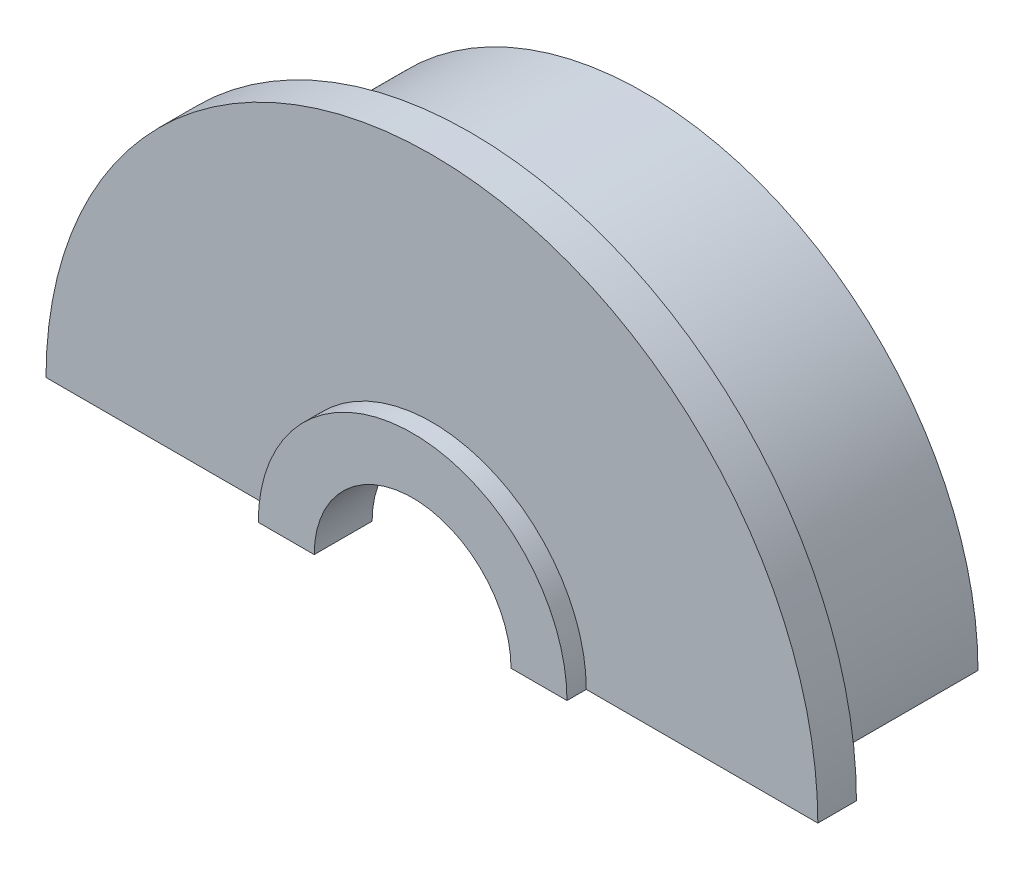
ISO-10303-21;
HEADER;
FILE_DESCRIPTION(('STEP AP214'),'2;1');
FILE_NAME('part.step','',(''),(''),'','','');
FILE_SCHEMA(('AUTOMOTIVE_DESIGN { 1 0 10303 214 1 1 1 1 }'));
ENDSEC;
DATA;
#1=APPLICATION_CONTEXT('core data for automotive mechanical design processes');
#2=APPLICATION_PROTOCOL_DEFINITION('international standard','automotive_design',2000,#1);
#3=PRODUCT_CONTEXT('',#1,'mechanical');
#4=PRODUCT('Part','Part','',(#3));
#5=PRODUCT_RELATED_PRODUCT_CATEGORY('part','',(#4));
#6=PRODUCT_DEFINITION_FORMATION('','',#4);
#7=PRODUCT_DEFINITION_CONTEXT('part definition',#1,'design');
#8=PRODUCT_DEFINITION('design','',#6,#7);
#9=PRODUCT_DEFINITION_SHAPE('','',#8);
#10=(LENGTH_UNIT() NAMED_UNIT(*) SI_UNIT(.MILLI.,.METRE.));
#11=(NAMED_UNIT(*) PLANE_ANGLE_UNIT() SI_UNIT($,.RADIAN.));
#12=(NAMED_UNIT(*) SI_UNIT($,.STERADIAN.) SOLID_ANGLE_UNIT());
#13=UNCERTAINTY_MEASURE_WITH_UNIT(LENGTH_MEASURE(1.E-05),#10,'distance_accuracy_value','');
#14=(GEOMETRIC_REPRESENTATION_CONTEXT(3) GLOBAL_UNCERTAINTY_ASSIGNED_CONTEXT((#13)) GLOBAL_UNIT_ASSIGNED_CONTEXT((#10,
#11,#12)) REPRESENTATION_CONTEXT('',''));
#15=CARTESIAN_POINT('',(0.,0.,0.));
#16=DIRECTION('',(0.,0.,1.));
#17=DIRECTION('',(1.,0.,0.));
#18=AXIS2_PLACEMENT_3D('',#15,#16,#17);
#19=CARTESIAN_POINT('',(0.,0.,9.));
#20=DIRECTION('',(0.,0.,-1.));
#21=DIRECTION('',(-1.,0.,0.));
#22=AXIS2_PLACEMENT_3D('',#19,#20,#21);
#23=CYLINDRICAL_SURFACE('',#22,8.125);
#24=CARTESIAN_POINT('',(0.,0.,3.));
#25=DIRECTION('',(0.,0.,-1.));
#26=DIRECTION('',(-1.,0.,0.));
#27=AXIS2_PLACEMENT_3D('',#24,#25,#26);
#28=CIRCLE('',#27,8.125);
#29=CARTESIAN_POINT('',(8.125,0.,3.));
#30=VERTEX_POINT('',#29);
#31=CARTESIAN_POINT('',(-8.125,0.,3.));
#32=VERTEX_POINT('',#31);
#33=EDGE_CURVE('E196',#30,#32,#28,.F.);
#34=ORIENTED_EDGE('',*,*,#33,.F.);
#35=DIRECTION('',(0.,0.,-1.));
#36=VECTOR('',#35,1.);
#37=CARTESIAN_POINT('',(8.125,0.,9.));
#38=LINE('',#37,#36);
#39=CARTESIAN_POINT('',(8.125,0.,9.));
#40=VERTEX_POINT('',#39);
#41=EDGE_CURVE('E154',#30,#40,#38,.F.);
#42=ORIENTED_EDGE('',*,*,#41,.T.);
#43=CARTESIAN_POINT('',(0.,0.,9.));
#44=DIRECTION('',(0.,0.,-1.));
#45=DIRECTION('',(-1.,0.,0.));
#46=AXIS2_PLACEMENT_3D('',#43,#44,#45);
#47=CIRCLE('',#46,8.125);
#48=CARTESIAN_POINT('',(-8.125,0.,9.));
#49=VERTEX_POINT('',#48);
#50=EDGE_CURVE('E181',#49,#40,#47,.T.);
#51=ORIENTED_EDGE('',*,*,#50,.F.);
#52=DIRECTION('',(0.,0.,-1.));
#53=VECTOR('',#52,1.);
#54=CARTESIAN_POINT('',(-8.125,0.,9.));
#55=LINE('',#54,#53);
#56=EDGE_CURVE('E146',#49,#32,#55,.T.);
#57=ORIENTED_EDGE('',*,*,#56,.T.);
#58=EDGE_LOOP('',(#34,#42,#51,#57));
#59=FACE_BOUND('',#58,.T.);
#60=ADVANCED_FACE('F37',(#59),#23,.F.);
#61=CARTESIAN_POINT('',(0.,0.,9.));
#62=DIRECTION('',(0.,0.,-1.));
#63=DIRECTION('',(-1.,0.,0.));
#64=AXIS2_PLACEMENT_3D('',#61,#62,#63);
#65=CYLINDRICAL_SURFACE('',#64,17.3);
#66=CARTESIAN_POINT('',(0.,0.,9.));
#67=DIRECTION('',(0.,0.,1.));
#68=DIRECTION('',(1.,0.,0.));
#69=AXIS2_PLACEMENT_3D('',#66,#67,#68);
#70=CIRCLE('',#69,17.3);
#71=CARTESIAN_POINT('',(17.3,0.,9.));
#72=VERTEX_POINT('',#71);
#73=CARTESIAN_POINT('',(-17.3,0.,9.));
#74=VERTEX_POINT('',#73);
#75=EDGE_CURVE('E187',#72,#74,#70,.T.);
#76=ORIENTED_EDGE('',*,*,#75,.F.);
#77=DIRECTION('',(0.,0.,-1.));
#78=VECTOR('',#77,1.);
#79=CARTESIAN_POINT('',(17.3,0.,9.));
#80=LINE('',#79,#78);
#81=CARTESIAN_POINT('',(17.3,0.,0.));
#82=VERTEX_POINT('',#81);
#83=EDGE_CURVE('E153',#72,#82,#80,.T.);
#84=ORIENTED_EDGE('',*,*,#83,.T.);
#85=CARTESIAN_POINT('',(0.,0.,0.));
#86=DIRECTION('',(0.,0.,1.));
#87=DIRECTION('',(1.,0.,0.));
#88=AXIS2_PLACEMENT_3D('',#85,#86,#87);
#89=CIRCLE('',#88,17.3);
#90=CARTESIAN_POINT('',(-17.3,0.,0.));
#91=VERTEX_POINT('',#90);
#92=EDGE_CURVE('E186',#82,#91,#89,.T.);
#93=ORIENTED_EDGE('',*,*,#92,.T.);
#94=DIRECTION('',(0.,0.,-1.));
#95=VECTOR('',#94,1.);
#96=CARTESIAN_POINT('',(-17.3,0.,9.));
#97=LINE('',#96,#95);
#98=EDGE_CURVE('E144',#91,#74,#97,.F.);
#99=ORIENTED_EDGE('',*,*,#98,.T.);
#100=EDGE_LOOP('',(#76,#84,#93,#99));
#101=FACE_BOUND('',#100,.T.);
#102=ADVANCED_FACE('F39',(#101),#65,.T.);
#103=CARTESIAN_POINT('',(0.,0.,0.));
#104=DIRECTION('',(0.,0.,1.));
#105=DIRECTION('',(1.,0.,0.));
#106=AXIS2_PLACEMENT_3D('',#103,#104,#105);
#107=PLANE('',#106);
#108=DIRECTION('',(-1.,0.,0.));
#109=VECTOR('',#108,1.);
#110=CARTESIAN_POINT('',(0.,0.,0.));
#111=LINE('',#110,#109);
#112=CARTESIAN_POINT('',(10.75,0.,0.));
#113=VERTEX_POINT('',#112);
#114=EDGE_CURVE('E140',#82,#113,#111,.T.);
#115=ORIENTED_EDGE('',*,*,#114,.T.);
#116=CARTESIAN_POINT('',(0.,0.,0.));
#117=DIRECTION('',(0.,0.,-1.));
#118=DIRECTION('',(-1.,0.,0.));
#119=AXIS2_PLACEMENT_3D('',#116,#117,#118);
#120=CIRCLE('',#119,10.75);
#121=CARTESIAN_POINT('',(-10.75,0.,0.));
#122=VERTEX_POINT('',#121);
#123=EDGE_CURVE('E128',#122,#113,#120,.T.);
#124=ORIENTED_EDGE('',*,*,#123,.F.);
#125=EDGE_CURVE('E138',#122,#91,#111,.T.);
#126=ORIENTED_EDGE('',*,*,#125,.T.);
#127=ORIENTED_EDGE('',*,*,#92,.F.);
#128=EDGE_LOOP('',(#115,#124,#126,#127));
#129=FACE_BOUND('',#128,.T.);
#130=ADVANCED_FACE('F136',(#129),#107,.F.);
#131=CARTESIAN_POINT('',(0.,0.,9.));
#132=DIRECTION('',(0.,0.,1.));
#133=DIRECTION('',(1.,0.,0.));
#134=AXIS2_PLACEMENT_3D('',#131,#132,#133);
#135=PLANE('',#134);
#136=ORIENTED_EDGE('',*,*,#50,.T.);
#137=DIRECTION('',(-1.,0.,0.));
#138=VECTOR('',#137,1.);
#139=CARTESIAN_POINT('',(0.,0.,9.));
#140=LINE('',#139,#138);
#141=CARTESIAN_POINT('',(5.1,0.,9.));
#142=VERTEX_POINT('',#141);
#143=EDGE_CURVE('E158',#40,#142,#140,.T.);
#144=ORIENTED_EDGE('',*,*,#143,.T.);
#145=CARTESIAN_POINT('',(0.,0.,9.));
#146=DIRECTION('',(0.,0.,1.));
#147=DIRECTION('',(1.,0.,0.));
#148=AXIS2_PLACEMENT_3D('',#145,#146,#147);
#149=CIRCLE('',#148,5.1);
#150=CARTESIAN_POINT('',(-5.1,0.,9.));
#151=VERTEX_POINT('',#150);
#152=EDGE_CURVE('E174',#142,#151,#149,.T.);
#153=ORIENTED_EDGE('',*,*,#152,.T.);
#154=EDGE_CURVE('E151',#151,#49,#140,.T.);
#155=ORIENTED_EDGE('',*,*,#154,.T.);
#156=EDGE_LOOP('',(#136,#144,#153,#155));
#157=FACE_BOUND('',#156,.T.);
#158=ADVANCED_FACE('F204',(#157),#135,.F.);
#159=CARTESIAN_POINT('',(0.,0.,11.));
#160=DIRECTION('',(0.,0.,1.));
#161=DIRECTION('',(1.,0.,0.));
#162=AXIS2_PLACEMENT_3D('',#159,#160,#161);
#163=PLANE('',#162);
#164=CARTESIAN_POINT('',(0.,0.,11.));
#165=DIRECTION('',(0.,0.,1.));
#166=DIRECTION('',(-1.,0.,0.));
#167=AXIS2_PLACEMENT_3D('',#164,#165,#166);
#168=CIRCLE('',#167,8.);
#169=CARTESIAN_POINT('',(8.,0.,11.));
#170=VERTEX_POINT('',#169);
#171=CARTESIAN_POINT('',(-8.,0.,11.));
#172=VERTEX_POINT('',#171);
#173=EDGE_CURVE('E60',#170,#172,#168,.T.);
#174=ORIENTED_EDGE('',*,*,#173,.F.);
#175=DIRECTION('',(1.,0.,0.));
#176=VECTOR('',#175,1.);
#177=CARTESIAN_POINT('',(25.5515040485711,0.,11.));
#178=LINE('',#177,#176);
#179=CARTESIAN_POINT('',(20.,0.,11.));
#180=VERTEX_POINT('',#179);
#181=EDGE_CURVE('E207',#170,#180,#178,.T.);
#182=ORIENTED_EDGE('',*,*,#181,.T.);
#183=CARTESIAN_POINT('',(0.,0.,11.));
#184=DIRECTION('',(0.,0.,1.));
#185=DIRECTION('',(1.,0.,0.));
#186=AXIS2_PLACEMENT_3D('',#183,#184,#185);
#187=CIRCLE('',#186,20.);
#188=CARTESIAN_POINT('',(-20.,0.,11.));
#189=VERTEX_POINT('',#188);
#190=EDGE_CURVE('E178',#180,#189,#187,.T.);
#191=ORIENTED_EDGE('',*,*,#190,.T.);
#192=EDGE_CURVE('E206',#189,#172,#178,.T.);
#193=ORIENTED_EDGE('',*,*,#192,.T.);
#194=EDGE_LOOP('',(#174,#182,#191,#193));
#195=FACE_BOUND('',#194,.T.);
#196=ADVANCED_FACE('F242',(#195),#163,.T.);
#197=CARTESIAN_POINT('',(0.,0.,9.));
#198=DIRECTION('',(0.,0.,1.));
#199=DIRECTION('',(1.,0.,0.));
#200=AXIS2_PLACEMENT_3D('',#197,#198,#199);
#201=CIRCLE('',#200,20.);
#202=CARTESIAN_POINT('',(20.,0.,9.));
#203=VERTEX_POINT('',#202);
#204=CARTESIAN_POINT('',(-20.,0.,9.));
#205=VERTEX_POINT('',#204);
#206=EDGE_CURVE('E177',#203,#205,#201,.T.);
#207=ORIENTED_EDGE('',*,*,#206,.F.);
#208=DIRECTION('',(-1.,0.,0.));
#209=VECTOR('',#208,1.);
#210=CARTESIAN_POINT('',(0.,0.,9.));
#211=LINE('',#210,#209);
#212=EDGE_CURVE('E156',#203,#72,#211,.T.);
#213=ORIENTED_EDGE('',*,*,#212,.T.);
#214=ORIENTED_EDGE('',*,*,#75,.T.);
#215=EDGE_CURVE('E148',#74,#205,#211,.T.);
#216=ORIENTED_EDGE('',*,*,#215,.T.);
#217=EDGE_LOOP('',(#207,#213,#214,#216));
#218=FACE_BOUND('',#217,.T.);
#219=ADVANCED_FACE('F250',(#218),#135,.F.);
#220=CARTESIAN_POINT('',(0.,0.,11.));
#221=DIRECTION('',(0.,0.,-1.));
#222=DIRECTION('',(-1.,0.,0.));
#223=AXIS2_PLACEMENT_3D('',#220,#221,#222);
#224=CYLINDRICAL_SURFACE('',#223,20.);
#225=ORIENTED_EDGE('',*,*,#190,.F.);
#226=DIRECTION('',(0.,0.,-1.));
#227=VECTOR('',#226,1.);
#228=CARTESIAN_POINT('',(20.,0.,11.));
#229=LINE('',#228,#227);
#230=EDGE_CURVE('E171',#180,#203,#229,.T.);
#231=ORIENTED_EDGE('',*,*,#230,.T.);
#232=ORIENTED_EDGE('',*,*,#206,.T.);
#233=DIRECTION('',(0.,0.,-1.));
#234=VECTOR('',#233,1.);
#235=CARTESIAN_POINT('',(-20.,0.,11.));
#236=LINE('',#235,#234);
#237=EDGE_CURVE('E166',#205,#189,#236,.F.);
#238=ORIENTED_EDGE('',*,*,#237,.T.);
#239=EDGE_LOOP('',(#225,#231,#232,#238));
#240=FACE_BOUND('',#239,.T.);
#241=ADVANCED_FACE('F244',(#240),#224,.T.);
#242=CARTESIAN_POINT('',(0.,0.,11.));
#243=DIRECTION('',(0.,0.,-1.));
#244=DIRECTION('',(-1.,0.,0.));
#245=AXIS2_PLACEMENT_3D('',#242,#243,#244);
#246=CYLINDRICAL_SURFACE('',#245,5.1);
#247=DIRECTION('',(0.,0.,-1.));
#248=VECTOR('',#247,1.);
#249=CARTESIAN_POINT('',(5.1,0.,11.));
#250=LINE('',#249,#248);
#251=CARTESIAN_POINT('',(5.1,0.,12.));
#252=VERTEX_POINT('',#251);
#253=EDGE_CURVE('E193',#252,#142,#250,.T.);
#254=ORIENTED_EDGE('',*,*,#253,.F.);
#255=CARTESIAN_POINT('',(0.,0.,12.));
#256=DIRECTION('',(0.,0.,-1.));
#257=DIRECTION('',(1.,0.,0.));
#258=AXIS2_PLACEMENT_3D('',#255,#256,#257);
#259=CIRCLE('',#258,5.1);
#260=CARTESIAN_POINT('',(-5.1,0.,12.));
#261=VERTEX_POINT('',#260);
#262=EDGE_CURVE('E220',#261,#252,#259,.T.);
#263=ORIENTED_EDGE('',*,*,#262,.F.);
#264=DIRECTION('',(0.,0.,-1.));
#265=VECTOR('',#264,1.);
#266=CARTESIAN_POINT('',(-5.1,0.,11.));
#267=LINE('',#266,#265);
#268=EDGE_CURVE('E190',#151,#261,#267,.F.);
#269=ORIENTED_EDGE('',*,*,#268,.F.);
#270=ORIENTED_EDGE('',*,*,#152,.F.);
#271=EDGE_LOOP('',(#254,#263,#269,#270));
#272=FACE_BOUND('',#271,.T.);
#273=ADVANCED_FACE('F239',(#272),#246,.F.);
#274=CARTESIAN_POINT('',(25.5515040485711,0.,11.));
#275=DIRECTION('',(0.,1.,0.));
#276=DIRECTION('',(0.,0.,1.));
#277=AXIS2_PLACEMENT_3D('',#274,#275,#276);
#278=PLANE('',#277);
#279=ORIENTED_EDGE('',*,*,#125,.F.);
#280=DIRECTION('',(0.,0.,-1.));
#281=VECTOR('',#280,1.);
#282=CARTESIAN_POINT('',(-10.75,0.,3.));
#283=LINE('',#282,#281);
#284=CARTESIAN_POINT('',(-10.75,0.,3.));
#285=VERTEX_POINT('',#284);
#286=EDGE_CURVE('E125',#122,#285,#283,.F.);
#287=ORIENTED_EDGE('',*,*,#286,.T.);
#288=DIRECTION('',(-1.,0.,0.));
#289=VECTOR('',#288,1.);
#290=CARTESIAN_POINT('',(25.5515040485711,0.,3.));
#291=LINE('',#290,#289);
#292=EDGE_CURVE('E132',#32,#285,#291,.T.);
#293=ORIENTED_EDGE('',*,*,#292,.F.);
#294=ORIENTED_EDGE('',*,*,#56,.F.);
#295=ORIENTED_EDGE('',*,*,#154,.F.);
#296=ORIENTED_EDGE('',*,*,#268,.T.);
#297=DIRECTION('',(1.,0.,0.));
#298=VECTOR('',#297,1.);
#299=CARTESIAN_POINT('',(-5.1,0.,12.));
#300=LINE('',#299,#298);
#301=CARTESIAN_POINT('',(-8.,0.,12.));
#302=VERTEX_POINT('',#301);
#303=EDGE_CURVE('E223',#302,#261,#300,.T.);
#304=ORIENTED_EDGE('',*,*,#303,.F.);
#305=DIRECTION('',(0.,0.,-1.));
#306=VECTOR('',#305,1.);
#307=CARTESIAN_POINT('',(-8.,0.,12.));
#308=LINE('',#307,#306);
#309=EDGE_CURVE('E210',#302,#172,#308,.T.);
#310=ORIENTED_EDGE('',*,*,#309,.T.);
#311=ORIENTED_EDGE('',*,*,#192,.F.);
#312=ORIENTED_EDGE('',*,*,#237,.F.);
#313=ORIENTED_EDGE('',*,*,#215,.F.);
#314=ORIENTED_EDGE('',*,*,#98,.F.);
#315=EDGE_LOOP('',(#279,#287,#293,#294,#295,#296,#304,#310,#311,#312,#313,#314));
#316=FACE_BOUND('',#315,.T.);
#317=ADVANCED_FACE('F142',(#316),#278,.F.);
#318=DIRECTION('',(-1.,0.,0.));
#319=VECTOR('',#318,1.);
#320=CARTESIAN_POINT('',(25.5515040485711,0.,3.));
#321=LINE('',#320,#319);
#322=CARTESIAN_POINT('',(10.75,0.,3.));
#323=VERTEX_POINT('',#322);
#324=EDGE_CURVE('E45',#323,#30,#321,.T.);
#325=ORIENTED_EDGE('',*,*,#324,.F.);
#326=DIRECTION('',(0.,0.,-1.));
#327=VECTOR('',#326,1.);
#328=CARTESIAN_POINT('',(10.75,0.,3.));
#329=LINE('',#328,#327);
#330=EDGE_CURVE('E11',#323,#113,#329,.T.);
#331=ORIENTED_EDGE('',*,*,#330,.T.);
#332=ORIENTED_EDGE('',*,*,#114,.F.);
#333=ORIENTED_EDGE('',*,*,#83,.F.);
#334=ORIENTED_EDGE('',*,*,#212,.F.);
#335=ORIENTED_EDGE('',*,*,#230,.F.);
#336=ORIENTED_EDGE('',*,*,#181,.F.);
#337=DIRECTION('',(0.,0.,-1.));
#338=VECTOR('',#337,1.);
#339=CARTESIAN_POINT('',(8.,0.,12.));
#340=LINE('',#339,#338);
#341=CARTESIAN_POINT('',(8.,0.,12.));
#342=VERTEX_POINT('',#341);
#343=EDGE_CURVE('E213',#342,#170,#340,.T.);
#344=ORIENTED_EDGE('',*,*,#343,.F.);
#345=DIRECTION('',(1.,0.,0.));
#346=VECTOR('',#345,1.);
#347=CARTESIAN_POINT('',(5.1,0.,12.));
#348=LINE('',#347,#346);
#349=EDGE_CURVE('E216',#252,#342,#348,.T.);
#350=ORIENTED_EDGE('',*,*,#349,.F.);
#351=ORIENTED_EDGE('',*,*,#253,.T.);
#352=ORIENTED_EDGE('',*,*,#143,.F.);
#353=ORIENTED_EDGE('',*,*,#41,.F.);
#354=EDGE_LOOP('',(#325,#331,#332,#333,#334,#335,#336,#344,#350,#351,#352,#353));
#355=FACE_BOUND('',#354,.T.);
#356=ADVANCED_FACE('F199',(#355),#278,.F.);
#357=CARTESIAN_POINT('',(0.,0.,12.));
#358=DIRECTION('',(0.,0.,-1.));
#359=DIRECTION('',(-1.,0.,0.));
#360=AXIS2_PLACEMENT_3D('',#357,#358,#359);
#361=CYLINDRICAL_SURFACE('',#360,8.);
#362=ORIENTED_EDGE('',*,*,#173,.T.);
#363=ORIENTED_EDGE('',*,*,#309,.F.);
#364=CARTESIAN_POINT('',(0.,0.,12.));
#365=DIRECTION('',(0.,0.,1.));
#366=DIRECTION('',(-1.,0.,0.));
#367=AXIS2_PLACEMENT_3D('',#364,#365,#366);
#368=CIRCLE('',#367,8.);
#369=EDGE_CURVE('E218',#342,#302,#368,.T.);
#370=ORIENTED_EDGE('',*,*,#369,.F.);
#371=ORIENTED_EDGE('',*,*,#343,.T.);
#372=EDGE_LOOP('',(#362,#363,#370,#371));
#373=FACE_BOUND('',#372,.T.);
#374=ADVANCED_FACE('F236',(#373),#361,.T.);
#375=CARTESIAN_POINT('',(0.,0.,12.));
#376=DIRECTION('',(0.,0.,-1.));
#377=DIRECTION('',(-1.,0.,0.));
#378=AXIS2_PLACEMENT_3D('',#375,#376,#377);
#379=PLANE('',#378);
#380=ORIENTED_EDGE('',*,*,#369,.T.);
#381=ORIENTED_EDGE('',*,*,#303,.T.);
#382=ORIENTED_EDGE('',*,*,#262,.T.);
#383=ORIENTED_EDGE('',*,*,#349,.T.);
#384=EDGE_LOOP('',(#380,#381,#382,#383));
#385=FACE_BOUND('',#384,.T.);
#386=ADVANCED_FACE('F232',(#385),#379,.F.);
#387=CARTESIAN_POINT('',(0.,0.,3.));
#388=DIRECTION('',(0.,0.,-1.));
#389=DIRECTION('',(-1.,0.,0.));
#390=AXIS2_PLACEMENT_3D('',#387,#388,#389);
#391=CYLINDRICAL_SURFACE('',#390,10.75);
#392=ORIENTED_EDGE('',*,*,#123,.T.);
#393=ORIENTED_EDGE('',*,*,#330,.F.);
#394=CARTESIAN_POINT('',(0.,0.,3.));
#395=DIRECTION('',(0.,0.,-1.));
#396=DIRECTION('',(-1.,0.,0.));
#397=AXIS2_PLACEMENT_3D('',#394,#395,#396);
#398=CIRCLE('',#397,10.75);
#399=EDGE_CURVE('E52',#285,#323,#398,.T.);
#400=ORIENTED_EDGE('',*,*,#399,.F.);
#401=ORIENTED_EDGE('',*,*,#286,.F.);
#402=EDGE_LOOP('',(#392,#393,#400,#401));
#403=FACE_BOUND('',#402,.T.);
#404=ADVANCED_FACE('F127',(#403),#391,.F.);
#405=CARTESIAN_POINT('',(0.,0.,3.));
#406=DIRECTION('',(0.,0.,-1.));
#407=DIRECTION('',(-1.,0.,0.));
#408=AXIS2_PLACEMENT_3D('',#405,#406,#407);
#409=PLANE('',#408);
#410=ORIENTED_EDGE('',*,*,#292,.T.);
#411=ORIENTED_EDGE('',*,*,#399,.T.);
#412=ORIENTED_EDGE('',*,*,#324,.T.);
#413=ORIENTED_EDGE('',*,*,#33,.T.);
#414=EDGE_LOOP('',(#410,#411,#412,#413));
#415=FACE_BOUND('',#414,.T.);
#416=ADVANCED_FACE('F195',(#415),#409,.T.);
#417=CLOSED_SHELL('',(#60,#102,#130,#158,#196,#219,#241,#273,#317,#356,#374,#386,#404,#416));
#418=MANIFOLD_SOLID_BREP('B2',#417);
#419=ADVANCED_BREP_SHAPE_REPRESENTATION('',(#18,#418),#14);
#420=SHAPE_DEFINITION_REPRESENTATION(#9,#419);
ENDSEC;
END-ISO-10303-21;
